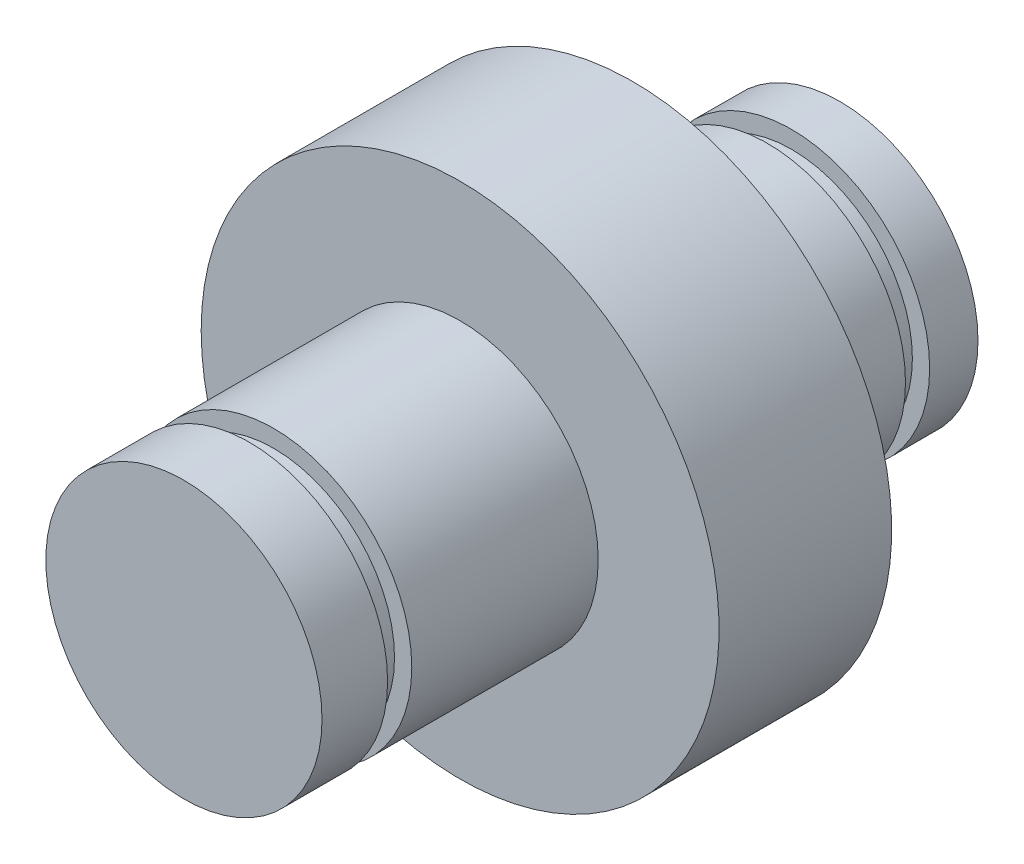
ISO-10303-21;
HEADER;
FILE_DESCRIPTION(('STEP AP214'),'2;1');
FILE_NAME('part.step','',(''),(''),'','','');
FILE_SCHEMA(('AUTOMOTIVE_DESIGN { 1 0 10303 214 1 1 1 1 }'));
ENDSEC;
DATA;
#1=APPLICATION_CONTEXT('core data for automotive mechanical design processes');
#2=APPLICATION_PROTOCOL_DEFINITION('international standard','automotive_design',2000,#1);
#3=PRODUCT_CONTEXT('',#1,'mechanical');
#4=PRODUCT('Part','Part','',(#3));
#5=PRODUCT_RELATED_PRODUCT_CATEGORY('part','',(#4));
#6=PRODUCT_DEFINITION_FORMATION('','',#4);
#7=PRODUCT_DEFINITION_CONTEXT('part definition',#1,'design');
#8=PRODUCT_DEFINITION('design','',#6,#7);
#9=PRODUCT_DEFINITION_SHAPE('','',#8);
#10=(LENGTH_UNIT() NAMED_UNIT(*) SI_UNIT(.MILLI.,.METRE.));
#11=(NAMED_UNIT(*) PLANE_ANGLE_UNIT() SI_UNIT($,.RADIAN.));
#12=(NAMED_UNIT(*) SI_UNIT($,.STERADIAN.) SOLID_ANGLE_UNIT());
#13=UNCERTAINTY_MEASURE_WITH_UNIT(LENGTH_MEASURE(1.E-05),#10,'distance_accuracy_value','');
#14=(GEOMETRIC_REPRESENTATION_CONTEXT(3) GLOBAL_UNCERTAINTY_ASSIGNED_CONTEXT((#13)) GLOBAL_UNIT_ASSIGNED_CONTEXT((#10,
#11,#12)) REPRESENTATION_CONTEXT('',''));
#15=CARTESIAN_POINT('',(0.,0.,0.));
#16=DIRECTION('',(0.,0.,1.));
#17=DIRECTION('',(1.,0.,0.));
#18=AXIS2_PLACEMENT_3D('',#15,#16,#17);
#19=CARTESIAN_POINT('',(0.,0.,8.));
#20=DIRECTION('',(0.,0.,-1.));
#21=DIRECTION('',(-1.,0.,0.));
#22=AXIS2_PLACEMENT_3D('',#19,#20,#21);
#23=CYLINDRICAL_SURFACE('',#22,4.);
#24=CARTESIAN_POINT('',(0.,0.,0.));
#25=DIRECTION('',(0.,0.,1.));
#26=DIRECTION('',(1.,0.,0.));
#27=AXIS2_PLACEMENT_3D('',#24,#25,#26);
#28=CIRCLE('',#27,4.);
#29=CARTESIAN_POINT('',(4.,0.,0.));
#30=VERTEX_POINT('',#29);
#31=EDGE_CURVE('E39',#30,#30,#28,.T.);
#32=ORIENTED_EDGE('',*,*,#31,.T.);
#33=EDGE_LOOP('',(#32));
#34=FACE_BOUND('',#33,.T.);
#35=CARTESIAN_POINT('',(0.,0.,5.4));
#36=DIRECTION('',(0.,0.,1.));
#37=DIRECTION('',(1.,0.,0.));
#38=AXIS2_PLACEMENT_3D('',#35,#36,#37);
#39=CIRCLE('',#38,4.);
#40=CARTESIAN_POINT('',(4.,0.,5.4));
#41=VERTEX_POINT('',#40);
#42=EDGE_CURVE('E65',#41,#41,#39,.T.);
#43=ORIENTED_EDGE('',*,*,#42,.F.);
#44=EDGE_LOOP('',(#43));
#45=FACE_BOUND('',#44,.T.);
#46=ADVANCED_FACE('F36',(#34,#45),#23,.T.);
#47=CARTESIAN_POINT('',(0.,0.,-11.));
#48=DIRECTION('',(0.,0.,1.));
#49=DIRECTION('',(1.,0.,0.));
#50=AXIS2_PLACEMENT_3D('',#47,#48,#49);
#51=CYLINDRICAL_SURFACE('',#50,4.);
#52=CARTESIAN_POINT('',(0.,0.,-5.));
#53=DIRECTION('',(0.,0.,-1.));
#54=DIRECTION('',(-1.,0.,0.));
#55=AXIS2_PLACEMENT_3D('',#52,#53,#54);
#56=CIRCLE('',#55,4.);
#57=CARTESIAN_POINT('',(-4.,0.,-5.));
#58=VERTEX_POINT('',#57);
#59=EDGE_CURVE('E10',#58,#58,#56,.T.);
#60=ORIENTED_EDGE('',*,*,#59,.T.);
#61=EDGE_LOOP('',(#60));
#62=FACE_BOUND('',#61,.T.);
#63=CARTESIAN_POINT('',(0.,0.,-8.9));
#64=DIRECTION('',(0.,0.,1.));
#65=DIRECTION('',(1.,0.,0.));
#66=AXIS2_PLACEMENT_3D('',#63,#64,#65);
#67=CIRCLE('',#66,4.);
#68=CARTESIAN_POINT('',(4.,0.,-8.9));
#69=VERTEX_POINT('',#68);
#70=EDGE_CURVE('E80',#69,#69,#67,.T.);
#71=ORIENTED_EDGE('',*,*,#70,.T.);
#72=EDGE_LOOP('',(#71));
#73=FACE_BOUND('',#72,.T.);
#74=ADVANCED_FACE('F123',(#62,#73),#51,.T.);
#75=CARTESIAN_POINT('',(0.,0.,-5.));
#76=DIRECTION('',(0.,0.,1.));
#77=DIRECTION('',(1.,0.,0.));
#78=AXIS2_PLACEMENT_3D('',#75,#76,#77);
#79=CYLINDRICAL_SURFACE('',#78,7.5);
#80=CARTESIAN_POINT('',(0.,0.,-5.));
#81=DIRECTION('',(0.,0.,-1.));
#82=DIRECTION('',(-1.,0.,0.));
#83=AXIS2_PLACEMENT_3D('',#80,#81,#82);
#84=CIRCLE('',#83,7.5);
#85=CARTESIAN_POINT('',(-7.5,0.,-5.));
#86=VERTEX_POINT('',#85);
#87=EDGE_CURVE('E54',#86,#86,#84,.T.);
#88=ORIENTED_EDGE('',*,*,#87,.F.);
#89=EDGE_LOOP('',(#88));
#90=FACE_BOUND('',#89,.T.);
#91=CARTESIAN_POINT('',(0.,0.,0.));
#92=DIRECTION('',(0.,0.,-1.));
#93=DIRECTION('',(-1.,0.,0.));
#94=AXIS2_PLACEMENT_3D('',#91,#92,#93);
#95=CIRCLE('',#94,7.5);
#96=CARTESIAN_POINT('',(-7.5,0.,0.));
#97=VERTEX_POINT('',#96);
#98=EDGE_CURVE('E58',#97,#97,#95,.T.);
#99=ORIENTED_EDGE('',*,*,#98,.T.);
#100=EDGE_LOOP('',(#99));
#101=FACE_BOUND('',#100,.T.);
#102=ADVANCED_FACE('F130',(#90,#101),#79,.T.);
#103=CARTESIAN_POINT('',(0.,0.,-5.));
#104=DIRECTION('',(0.,0.,-1.));
#105=DIRECTION('',(-1.,0.,0.));
#106=AXIS2_PLACEMENT_3D('',#103,#104,#105);
#107=PLANE('',#106);
#108=ORIENTED_EDGE('',*,*,#59,.F.);
#109=EDGE_LOOP('',(#108));
#110=FACE_BOUND('',#109,.T.);
#111=ORIENTED_EDGE('',*,*,#87,.T.);
#112=EDGE_LOOP('',(#111));
#113=FACE_BOUND('',#112,.T.);
#114=ADVANCED_FACE('F147',(#110,#113),#107,.T.);
#115=CARTESIAN_POINT('',(0.,0.,0.));
#116=DIRECTION('',(0.,0.,-1.));
#117=DIRECTION('',(-1.,0.,0.));
#118=AXIS2_PLACEMENT_3D('',#115,#116,#117);
#119=PLANE('',#118);
#120=ORIENTED_EDGE('',*,*,#31,.F.);
#121=EDGE_LOOP('',(#120));
#122=FACE_BOUND('',#121,.T.);
#123=ORIENTED_EDGE('',*,*,#98,.F.);
#124=EDGE_LOOP('',(#123));
#125=FACE_BOUND('',#124,.T.);
#126=ADVANCED_FACE('F149',(#122,#125),#119,.F.);
#127=CARTESIAN_POINT('',(-4.,0.,-9.6));
#128=DIRECTION('',(0.,0.,1.));
#129=DIRECTION('',(1.,0.,0.));
#130=AXIS2_PLACEMENT_3D('',#127,#128,#129);
#131=PLANE('',#130);
#132=CARTESIAN_POINT('',(0.,0.,-9.6));
#133=DIRECTION('',(0.,0.,1.));
#134=DIRECTION('',(1.,0.,0.));
#135=AXIS2_PLACEMENT_3D('',#132,#133,#134);
#136=CIRCLE('',#135,4.);
#137=CARTESIAN_POINT('',(4.,0.,-9.6));
#138=VERTEX_POINT('',#137);
#139=EDGE_CURVE('E91',#138,#138,#136,.T.);
#140=ORIENTED_EDGE('',*,*,#139,.T.);
#141=EDGE_LOOP('',(#140));
#142=FACE_BOUND('',#141,.T.);
#143=CARTESIAN_POINT('',(0.,0.,-9.6));
#144=DIRECTION('',(0.,0.,1.));
#145=DIRECTION('',(1.,0.,0.));
#146=AXIS2_PLACEMENT_3D('',#143,#144,#145);
#147=CIRCLE('',#146,3.5);
#148=CARTESIAN_POINT('',(3.5,0.,-9.6));
#149=VERTEX_POINT('',#148);
#150=EDGE_CURVE('E88',#149,#149,#147,.T.);
#151=ORIENTED_EDGE('',*,*,#150,.F.);
#152=EDGE_LOOP('',(#151));
#153=FACE_BOUND('',#152,.T.);
#154=ADVANCED_FACE('F152',(#142,#153),#131,.T.);
#155=CARTESIAN_POINT('',(0.,0.,0.));
#156=DIRECTION('',(0.,0.,1.));
#157=DIRECTION('',(1.,0.,0.));
#158=AXIS2_PLACEMENT_3D('',#155,#156,#157);
#159=CYLINDRICAL_SURFACE('',#158,3.5);
#160=ORIENTED_EDGE('',*,*,#150,.T.);
#161=EDGE_LOOP('',(#160));
#162=FACE_BOUND('',#161,.T.);
#163=CARTESIAN_POINT('',(0.,0.,-8.9));
#164=DIRECTION('',(0.,0.,1.));
#165=DIRECTION('',(1.,0.,0.));
#166=AXIS2_PLACEMENT_3D('',#163,#164,#165);
#167=CIRCLE('',#166,3.5);
#168=CARTESIAN_POINT('',(3.5,0.,-8.9));
#169=VERTEX_POINT('',#168);
#170=EDGE_CURVE('E84',#169,#169,#167,.T.);
#171=ORIENTED_EDGE('',*,*,#170,.F.);
#172=EDGE_LOOP('',(#171));
#173=FACE_BOUND('',#172,.T.);
#174=ADVANCED_FACE('F165',(#162,#173),#159,.T.);
#175=CARTESIAN_POINT('',(-4.,0.,-8.9));
#176=DIRECTION('',(0.,0.,-1.));
#177=DIRECTION('',(-1.,0.,0.));
#178=AXIS2_PLACEMENT_3D('',#175,#176,#177);
#179=PLANE('',#178);
#180=ORIENTED_EDGE('',*,*,#170,.T.);
#181=EDGE_LOOP('',(#180));
#182=FACE_BOUND('',#181,.T.);
#183=ORIENTED_EDGE('',*,*,#70,.F.);
#184=EDGE_LOOP('',(#183));
#185=FACE_BOUND('',#184,.T.);
#186=ADVANCED_FACE('F162',(#182,#185),#179,.T.);
#187=CARTESIAN_POINT('',(0.,0.,-11.));
#188=DIRECTION('',(0.,0.,-1.));
#189=DIRECTION('',(-1.,0.,0.));
#190=AXIS2_PLACEMENT_3D('',#187,#188,#189);
#191=PLANE('',#190);
#192=CARTESIAN_POINT('',(0.,0.,-11.));
#193=DIRECTION('',(0.,0.,-1.));
#194=DIRECTION('',(-1.,0.,0.));
#195=AXIS2_PLACEMENT_3D('',#192,#193,#194);
#196=CIRCLE('',#195,4.);
#197=CARTESIAN_POINT('',(-4.,0.,-11.));
#198=VERTEX_POINT('',#197);
#199=EDGE_CURVE('E52',#198,#198,#196,.T.);
#200=ORIENTED_EDGE('',*,*,#199,.T.);
#201=EDGE_LOOP('',(#200));
#202=FACE_BOUND('',#201,.T.);
#203=ADVANCED_FACE('F158',(#202),#191,.T.);
#204=ORIENTED_EDGE('',*,*,#199,.F.);
#205=EDGE_LOOP('',(#204));
#206=FACE_BOUND('',#205,.T.);
#207=ORIENTED_EDGE('',*,*,#139,.F.);
#208=EDGE_LOOP('',(#207));
#209=FACE_BOUND('',#208,.T.);
#210=ADVANCED_FACE('F120',(#206,#209),#51,.T.);
#211=CARTESIAN_POINT('',(-4.,0.,5.4));
#212=DIRECTION('',(0.,0.,1.));
#213=DIRECTION('',(1.,0.,0.));
#214=AXIS2_PLACEMENT_3D('',#211,#212,#213);
#215=PLANE('',#214);
#216=ORIENTED_EDGE('',*,*,#42,.T.);
#217=EDGE_LOOP('',(#216));
#218=FACE_BOUND('',#217,.T.);
#219=CARTESIAN_POINT('',(0.,0.,5.4));
#220=DIRECTION('',(0.,0.,1.));
#221=DIRECTION('',(1.,0.,0.));
#222=AXIS2_PLACEMENT_3D('',#219,#220,#221);
#223=CIRCLE('',#222,3.5);
#224=CARTESIAN_POINT('',(3.5,0.,5.4));
#225=VERTEX_POINT('',#224);
#226=EDGE_CURVE('E70',#225,#225,#223,.T.);
#227=ORIENTED_EDGE('',*,*,#226,.F.);
#228=EDGE_LOOP('',(#227));
#229=FACE_BOUND('',#228,.T.);
#230=ADVANCED_FACE('F111',(#218,#229),#215,.T.);
#231=CARTESIAN_POINT('',(0.,0.,0.));
#232=DIRECTION('',(0.,0.,1.));
#233=DIRECTION('',(1.,0.,0.));
#234=AXIS2_PLACEMENT_3D('',#231,#232,#233);
#235=CYLINDRICAL_SURFACE('',#234,3.5);
#236=ORIENTED_EDGE('',*,*,#226,.T.);
#237=EDGE_LOOP('',(#236));
#238=FACE_BOUND('',#237,.T.);
#239=CARTESIAN_POINT('',(0.,0.,6.1));
#240=DIRECTION('',(0.,0.,1.));
#241=DIRECTION('',(1.,0.,0.));
#242=AXIS2_PLACEMENT_3D('',#239,#240,#241);
#243=CIRCLE('',#242,3.5);
#244=CARTESIAN_POINT('',(3.5,0.,6.1));
#245=VERTEX_POINT('',#244);
#246=EDGE_CURVE('E76',#245,#245,#243,.T.);
#247=ORIENTED_EDGE('',*,*,#246,.F.);
#248=EDGE_LOOP('',(#247));
#249=FACE_BOUND('',#248,.T.);
#250=ADVANCED_FACE('F109',(#238,#249),#235,.T.);
#251=CARTESIAN_POINT('',(-4.,0.,6.1));
#252=DIRECTION('',(0.,0.,-1.));
#253=DIRECTION('',(-1.,0.,0.));
#254=AXIS2_PLACEMENT_3D('',#251,#252,#253);
#255=PLANE('',#254);
#256=ORIENTED_EDGE('',*,*,#246,.T.);
#257=EDGE_LOOP('',(#256));
#258=FACE_BOUND('',#257,.T.);
#259=CARTESIAN_POINT('',(0.,0.,6.1));
#260=DIRECTION('',(0.,0.,1.));
#261=DIRECTION('',(1.,0.,0.));
#262=AXIS2_PLACEMENT_3D('',#259,#260,#261);
#263=CIRCLE('',#262,4.);
#264=CARTESIAN_POINT('',(4.,0.,6.1));
#265=VERTEX_POINT('',#264);
#266=EDGE_CURVE('E94',#265,#265,#263,.T.);
#267=ORIENTED_EDGE('',*,*,#266,.F.);
#268=EDGE_LOOP('',(#267));
#269=FACE_BOUND('',#268,.T.);
#270=ADVANCED_FACE('F106',(#258,#269),#255,.T.);
#271=CARTESIAN_POINT('',(0.,0.,8.));
#272=DIRECTION('',(0.,0.,1.));
#273=DIRECTION('',(1.,0.,0.));
#274=AXIS2_PLACEMENT_3D('',#271,#272,#273);
#275=PLANE('',#274);
#276=CARTESIAN_POINT('',(0.,0.,8.));
#277=DIRECTION('',(0.,0.,1.));
#278=DIRECTION('',(1.,0.,0.));
#279=AXIS2_PLACEMENT_3D('',#276,#277,#278);
#280=CIRCLE('',#279,4.);
#281=CARTESIAN_POINT('',(4.,0.,8.));
#282=VERTEX_POINT('',#281);
#283=EDGE_CURVE('E44',#282,#282,#280,.T.);
#284=ORIENTED_EDGE('',*,*,#283,.T.);
#285=EDGE_LOOP('',(#284));
#286=FACE_BOUND('',#285,.T.);
#287=ADVANCED_FACE('F118',(#286),#275,.T.);
#288=ORIENTED_EDGE('',*,*,#283,.F.);
#289=EDGE_LOOP('',(#288));
#290=FACE_BOUND('',#289,.T.);
#291=ORIENTED_EDGE('',*,*,#266,.T.);
#292=EDGE_LOOP('',(#291));
#293=FACE_BOUND('',#292,.T.);
#294=ADVANCED_FACE('F125',(#290,#293),#23,.T.);
#295=CLOSED_SHELL('',(#46,#74,#102,#114,#126,#154,#174,#186,#203,#210,#230,#250,#270,#287,#294));
#296=MANIFOLD_SOLID_BREP('B2',#295);
#297=ADVANCED_BREP_SHAPE_REPRESENTATION('',(#18,#296),#14);
#298=SHAPE_DEFINITION_REPRESENTATION(#9,#297);
ENDSEC;
END-ISO-10303-21;
